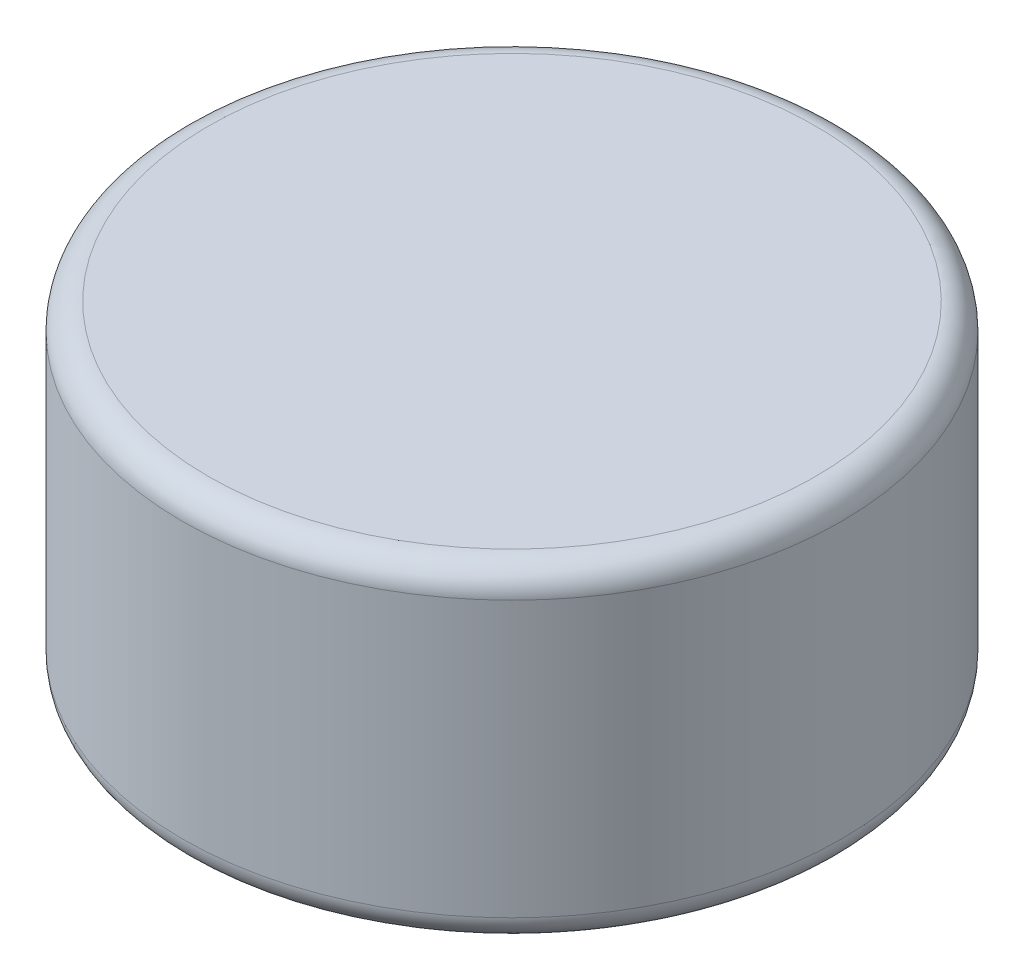
ISO-10303-21;
HEADER;
FILE_DESCRIPTION(('STEP AP214'),'2;1');
FILE_NAME('part.step','',(''),(''),'','','');
FILE_SCHEMA(('AUTOMOTIVE_DESIGN { 1 0 10303 214 1 1 1 1 }'));
ENDSEC;
DATA;
#1=APPLICATION_CONTEXT('core data for automotive mechanical design processes');
#2=APPLICATION_PROTOCOL_DEFINITION('international standard','automotive_design',2000,#1);
#3=PRODUCT_CONTEXT('',#1,'mechanical');
#4=PRODUCT('Part','Part','',(#3));
#5=PRODUCT_RELATED_PRODUCT_CATEGORY('part','',(#4));
#6=PRODUCT_DEFINITION_FORMATION('','',#4);
#7=PRODUCT_DEFINITION_CONTEXT('part definition',#1,'design');
#8=PRODUCT_DEFINITION('design','',#6,#7);
#9=PRODUCT_DEFINITION_SHAPE('','',#8);
#10=(LENGTH_UNIT() NAMED_UNIT(*) SI_UNIT(.MILLI.,.METRE.));
#11=(NAMED_UNIT(*) PLANE_ANGLE_UNIT() SI_UNIT($,.RADIAN.));
#12=(NAMED_UNIT(*) SI_UNIT($,.STERADIAN.) SOLID_ANGLE_UNIT());
#13=UNCERTAINTY_MEASURE_WITH_UNIT(LENGTH_MEASURE(1.E-05),#10,'distance_accuracy_value','');
#14=(GEOMETRIC_REPRESENTATION_CONTEXT(3) GLOBAL_UNCERTAINTY_ASSIGNED_CONTEXT((#13)) GLOBAL_UNIT_ASSIGNED_CONTEXT((#10,
#11,#12)) REPRESENTATION_CONTEXT('',''));
#15=CARTESIAN_POINT('',(0.,0.,0.));
#16=DIRECTION('',(0.,0.,1.));
#17=DIRECTION('',(1.,0.,0.));
#18=AXIS2_PLACEMENT_3D('',#15,#16,#17);
#19=CARTESIAN_POINT('',(0.,6.3,0.));
#20=DIRECTION('',(0.,-1.,0.));
#21=DIRECTION('',(0.,0.,-1.));
#22=AXIS2_PLACEMENT_3D('',#19,#20,#21);
#23=CYLINDRICAL_SURFACE('',#22,6.35);
#24=CARTESIAN_POINT('',(0.,0.5,0.));
#25=DIRECTION('',(0.,1.,0.));
#26=DIRECTION('',(0.,0.,1.));
#27=AXIS2_PLACEMENT_3D('',#24,#25,#26);
#28=CIRCLE('',#27,6.35);
#29=CARTESIAN_POINT('',(0.,0.5,6.35));
#30=VERTEX_POINT('',#29);
#31=EDGE_CURVE('E47',#30,#30,#28,.T.);
#32=ORIENTED_EDGE('',*,*,#31,.T.);
#33=EDGE_LOOP('',(#32));
#34=FACE_BOUND('',#33,.T.);
#35=CARTESIAN_POINT('',(0.,5.8,0.));
#36=DIRECTION('',(0.,1.,0.));
#37=DIRECTION('',(0.,0.,1.));
#38=AXIS2_PLACEMENT_3D('',#35,#36,#37);
#39=CIRCLE('',#38,6.35);
#40=CARTESIAN_POINT('',(0.,5.8,6.35));
#41=VERTEX_POINT('',#40);
#42=EDGE_CURVE('E51',#41,#41,#39,.F.);
#43=ORIENTED_EDGE('',*,*,#42,.T.);
#44=EDGE_LOOP('',(#43));
#45=FACE_BOUND('',#44,.T.);
#46=ADVANCED_FACE('F36',(#34,#45),#23,.T.);
#47=CARTESIAN_POINT('',(0.,6.3,0.));
#48=DIRECTION('',(0.,1.,0.));
#49=DIRECTION('',(0.,0.,1.));
#50=AXIS2_PLACEMENT_3D('',#47,#48,#49);
#51=PLANE('',#50);
#52=CARTESIAN_POINT('',(0.,6.3,0.));
#53=DIRECTION('',(0.,1.,0.));
#54=DIRECTION('',(0.,0.,1.));
#55=AXIS2_PLACEMENT_3D('',#52,#53,#54);
#56=CIRCLE('',#55,5.85);
#57=CARTESIAN_POINT('',(0.,6.3,5.85));
#58=VERTEX_POINT('',#57);
#59=EDGE_CURVE('E10',#58,#58,#56,.T.);
#60=ORIENTED_EDGE('',*,*,#59,.T.);
#61=EDGE_LOOP('',(#60));
#62=FACE_BOUND('',#61,.T.);
#63=ADVANCED_FACE('F67',(#62),#51,.T.);
#64=CARTESIAN_POINT('',(0.,0.,0.));
#65=DIRECTION('',(0.,1.,0.));
#66=DIRECTION('',(0.,0.,1.));
#67=AXIS2_PLACEMENT_3D('',#64,#65,#66);
#68=PLANE('',#67);
#69=CARTESIAN_POINT('',(0.,0.,0.));
#70=DIRECTION('',(0.,1.,0.));
#71=DIRECTION('',(0.,0.,1.));
#72=AXIS2_PLACEMENT_3D('',#69,#70,#71);
#73=CIRCLE('',#72,5.85);
#74=CARTESIAN_POINT('',(0.,0.,5.85));
#75=VERTEX_POINT('',#74);
#76=EDGE_CURVE('E43',#75,#75,#73,.F.);
#77=ORIENTED_EDGE('',*,*,#76,.T.);
#78=EDGE_LOOP('',(#77));
#79=FACE_BOUND('',#78,.T.);
#80=ADVANCED_FACE('F64',(#79),#68,.F.);
#81=CARTESIAN_POINT('',(0.,0.5,0.));
#82=DIRECTION('',(0.,1.,0.));
#83=DIRECTION('',(0.,0.,1.));
#84=AXIS2_PLACEMENT_3D('',#81,#82,#83);
#85=TOROIDAL_SURFACE('',#84,5.85,0.5);
#86=ORIENTED_EDGE('',*,*,#76,.F.);
#87=EDGE_LOOP('',(#86));
#88=FACE_BOUND('',#87,.T.);
#89=ORIENTED_EDGE('',*,*,#31,.F.);
#90=EDGE_LOOP('',(#89));
#91=FACE_BOUND('',#90,.T.);
#92=ADVANCED_FACE('F60',(#88,#91),#85,.T.);
#93=CARTESIAN_POINT('',(0.,5.8,0.));
#94=DIRECTION('',(0.,1.,0.));
#95=DIRECTION('',(0.,0.,1.));
#96=AXIS2_PLACEMENT_3D('',#93,#94,#95);
#97=TOROIDAL_SURFACE('',#96,5.85,0.5);
#98=ORIENTED_EDGE('',*,*,#42,.F.);
#99=EDGE_LOOP('',(#98));
#100=FACE_BOUND('',#99,.T.);
#101=ORIENTED_EDGE('',*,*,#59,.F.);
#102=EDGE_LOOP('',(#101));
#103=FACE_BOUND('',#102,.T.);
#104=ADVANCED_FACE('F38',(#100,#103),#97,.T.);
#105=CLOSED_SHELL('',(#46,#63,#80,#92,#104));
#106=MANIFOLD_SOLID_BREP('B2',#105);
#107=ADVANCED_BREP_SHAPE_REPRESENTATION('',(#18,#106),#14);
#108=SHAPE_DEFINITION_REPRESENTATION(#9,#107);
ENDSEC;
END-ISO-10303-21;
